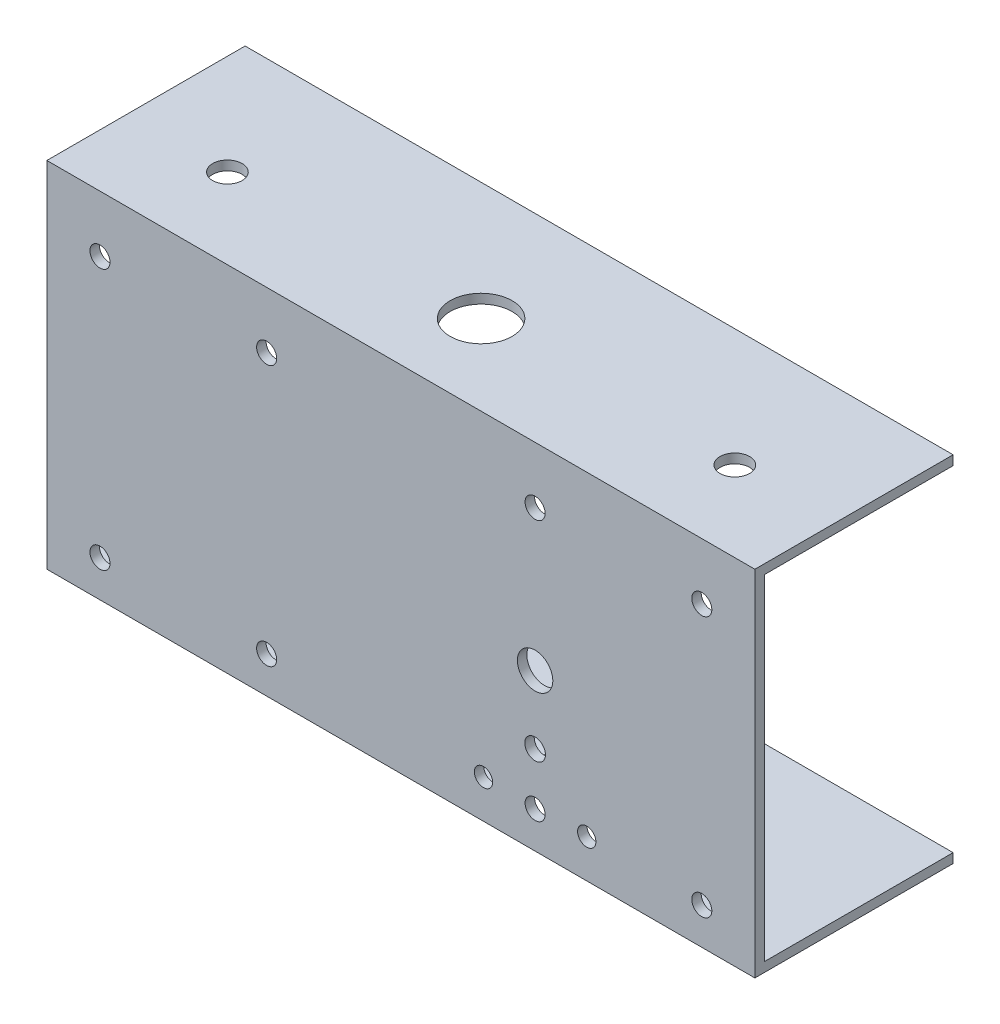
ISO-10303-21;
HEADER;
FILE_DESCRIPTION(('STEP AP214'),'2;1');
FILE_NAME('part.step','',(''),(''),'','','');
FILE_SCHEMA(('AUTOMOTIVE_DESIGN { 1 0 10303 214 1 1 1 1 }'));
ENDSEC;
DATA;
#1=APPLICATION_CONTEXT('core data for automotive mechanical design processes');
#2=APPLICATION_PROTOCOL_DEFINITION('international standard','automotive_design',2000,#1);
#3=PRODUCT_CONTEXT('',#1,'mechanical');
#4=PRODUCT('Part','Part','',(#3));
#5=PRODUCT_RELATED_PRODUCT_CATEGORY('part','',(#4));
#6=PRODUCT_DEFINITION_FORMATION('','',#4);
#7=PRODUCT_DEFINITION_CONTEXT('part definition',#1,'design');
#8=PRODUCT_DEFINITION('design','',#6,#7);
#9=PRODUCT_DEFINITION_SHAPE('','',#8);
#10=(LENGTH_UNIT() NAMED_UNIT(*) SI_UNIT(.MILLI.,.METRE.));
#11=(NAMED_UNIT(*) PLANE_ANGLE_UNIT() SI_UNIT($,.RADIAN.));
#12=(NAMED_UNIT(*) SI_UNIT($,.STERADIAN.) SOLID_ANGLE_UNIT());
#13=UNCERTAINTY_MEASURE_WITH_UNIT(LENGTH_MEASURE(1.E-05),#10,'distance_accuracy_value','');
#14=(GEOMETRIC_REPRESENTATION_CONTEXT(3) GLOBAL_UNCERTAINTY_ASSIGNED_CONTEXT((#13)) GLOBAL_UNIT_ASSIGNED_CONTEXT((#10,
#11,#12)) REPRESENTATION_CONTEXT('',''));
#15=CARTESIAN_POINT('',(0.,0.,0.));
#16=DIRECTION('',(0.,0.,1.));
#17=DIRECTION('',(1.,0.,0.));
#18=AXIS2_PLACEMENT_3D('',#15,#16,#17);
#19=CARTESIAN_POINT('',(60.,60.,12.));
#20=DIRECTION('',(0.,0.,-1.));
#21=DIRECTION('',(-1.,0.,0.));
#22=AXIS2_PLACEMENT_3D('',#19,#20,#21);
#23=PLANE('',#22);
#24=CARTESIAN_POINT('',(51.0000000000001,50.4,12.));
#25=DIRECTION('',(0.,0.,-1.));
#26=DIRECTION('',(-1.,0.,0.));
#27=AXIS2_PLACEMENT_3D('',#24,#25,#26);
#28=CIRCLE('',#27,1.70000000000001);
#29=CARTESIAN_POINT('',(49.3000000000001,50.4,12.));
#30=VERTEX_POINT('',#29);
#31=EDGE_CURVE('E664',#30,#30,#28,.F.);
#32=ORIENTED_EDGE('',*,*,#31,.T.);
#33=EDGE_LOOP('',(#32));
#34=FACE_BOUND('',#33,.T.);
#35=CARTESIAN_POINT('',(-22.7499999999999,6.2,12.));
#36=DIRECTION('',(0.,0.,1.));
#37=DIRECTION('',(1.,0.,0.));
#38=AXIS2_PLACEMENT_3D('',#35,#36,#37);
#39=CIRCLE('',#38,1.70000000000001);
#40=CARTESIAN_POINT('',(-21.0499999999999,6.2,12.));
#41=VERTEX_POINT('',#40);
#42=EDGE_CURVE('E665',#41,#41,#39,.T.);
#43=ORIENTED_EDGE('',*,*,#42,.T.);
#44=EDGE_LOOP('',(#43));
#45=FACE_BOUND('',#44,.T.);
#46=CARTESIAN_POINT('',(22.75,6.19999999999998,12.));
#47=DIRECTION('',(0.,0.,-1.));
#48=DIRECTION('',(-1.,0.,0.));
#49=AXIS2_PLACEMENT_3D('',#46,#47,#48);
#50=CIRCLE('',#49,1.70000000000001);
#51=CARTESIAN_POINT('',(21.05,6.19999999999998,12.));
#52=VERTEX_POINT('',#51);
#53=EDGE_CURVE('E670',#52,#52,#50,.T.);
#54=ORIENTED_EDGE('',*,*,#53,.F.);
#55=EDGE_LOOP('',(#54));
#56=FACE_BOUND('',#55,.T.);
#57=CARTESIAN_POINT('',(51.0000000000001,6.19999999999998,12.));
#58=DIRECTION('',(0.,0.,-1.));
#59=DIRECTION('',(-1.,0.,0.));
#60=AXIS2_PLACEMENT_3D('',#57,#58,#59);
#61=CIRCLE('',#60,1.70000000000001);
#62=CARTESIAN_POINT('',(49.3000000000001,6.19999999999998,12.));
#63=VERTEX_POINT('',#62);
#64=EDGE_CURVE('E701',#63,#63,#61,.T.);
#65=ORIENTED_EDGE('',*,*,#64,.F.);
#66=EDGE_LOOP('',(#65));
#67=FACE_BOUND('',#66,.T.);
#68=CARTESIAN_POINT('',(-51.,50.4,12.));
#69=DIRECTION('',(0.,0.,-1.));
#70=DIRECTION('',(-1.,0.,0.));
#71=AXIS2_PLACEMENT_3D('',#68,#69,#70);
#72=CIRCLE('',#71,1.70000000000001);
#73=CARTESIAN_POINT('',(-52.7,50.4,12.));
#74=VERTEX_POINT('',#73);
#75=EDGE_CURVE('E255',#74,#74,#72,.T.);
#76=ORIENTED_EDGE('',*,*,#75,.F.);
#77=EDGE_LOOP('',(#76));
#78=FACE_BOUND('',#77,.T.);
#79=CARTESIAN_POINT('',(22.75,26.5,12.));
#80=DIRECTION('',(0.,0.,-1.));
#81=DIRECTION('',(-1.,0.,0.));
#82=AXIS2_PLACEMENT_3D('',#79,#80,#81);
#83=CIRCLE('',#82,3.);
#84=CARTESIAN_POINT('',(19.75,26.5,12.));
#85=VERTEX_POINT('',#84);
#86=EDGE_CURVE('E241',#85,#85,#83,.F.);
#87=ORIENTED_EDGE('',*,*,#86,.T.);
#88=EDGE_LOOP('',(#87));
#89=FACE_BOUND('',#88,.T.);
#90=CARTESIAN_POINT('',(22.75,15.,12.));
#91=DIRECTION('',(0.,0.,-1.));
#92=DIRECTION('',(-1.,0.,0.));
#93=AXIS2_PLACEMENT_3D('',#90,#91,#92);
#94=CIRCLE('',#93,1.75);
#95=CARTESIAN_POINT('',(21.,15.,12.));
#96=VERTEX_POINT('',#95);
#97=EDGE_CURVE('E283',#96,#96,#94,.F.);
#98=ORIENTED_EDGE('',*,*,#97,.T.);
#99=EDGE_LOOP('',(#98));
#100=FACE_BOUND('',#99,.T.);
#101=CARTESIAN_POINT('',(14.,6.5,12.));
#102=DIRECTION('',(0.,0.,-1.));
#103=DIRECTION('',(-1.,0.,0.));
#104=AXIS2_PLACEMENT_3D('',#101,#102,#103);
#105=CIRCLE('',#104,1.55);
#106=CARTESIAN_POINT('',(12.45,6.5,12.));
#107=VERTEX_POINT('',#106);
#108=EDGE_CURVE('E274',#107,#107,#105,.F.);
#109=ORIENTED_EDGE('',*,*,#108,.T.);
#110=EDGE_LOOP('',(#109));
#111=FACE_BOUND('',#110,.T.);
#112=CARTESIAN_POINT('',(31.5,6.50000000000001,12.));
#113=DIRECTION('',(0.,0.,-1.));
#114=DIRECTION('',(-1.,0.,0.));
#115=AXIS2_PLACEMENT_3D('',#112,#113,#114);
#116=CIRCLE('',#115,1.55);
#117=CARTESIAN_POINT('',(29.95,6.50000000000001,12.));
#118=VERTEX_POINT('',#117);
#119=EDGE_CURVE('E278',#118,#118,#116,.T.);
#120=ORIENTED_EDGE('',*,*,#119,.F.);
#121=EDGE_LOOP('',(#120));
#122=FACE_BOUND('',#121,.T.);
#123=CARTESIAN_POINT('',(-22.7499999999999,50.4,12.));
#124=DIRECTION('',(0.,0.,-1.));
#125=DIRECTION('',(-1.,0.,0.));
#126=AXIS2_PLACEMENT_3D('',#123,#124,#125);
#127=CIRCLE('',#126,1.70000000000001);
#128=CARTESIAN_POINT('',(-24.4499999999999,50.4,12.));
#129=VERTEX_POINT('',#128);
#130=EDGE_CURVE('E674',#129,#129,#127,.T.);
#131=ORIENTED_EDGE('',*,*,#130,.F.);
#132=EDGE_LOOP('',(#131));
#133=FACE_BOUND('',#132,.T.);
#134=CARTESIAN_POINT('',(22.75,50.4,12.));
#135=DIRECTION('',(0.,0.,-1.));
#136=DIRECTION('',(-1.,0.,0.));
#137=AXIS2_PLACEMENT_3D('',#134,#135,#136);
#138=CIRCLE('',#137,1.70000000000001);
#139=CARTESIAN_POINT('',(21.05,50.4,12.));
#140=VERTEX_POINT('',#139);
#141=EDGE_CURVE('E667',#140,#140,#138,.F.);
#142=ORIENTED_EDGE('',*,*,#141,.T.);
#143=EDGE_LOOP('',(#142));
#144=FACE_BOUND('',#143,.T.);
#145=CARTESIAN_POINT('',(-51.,6.2,12.));
#146=DIRECTION('',(0.,0.,1.));
#147=DIRECTION('',(1.,0.,0.));
#148=AXIS2_PLACEMENT_3D('',#145,#146,#147);
#149=CIRCLE('',#148,1.70000000000001);
#150=CARTESIAN_POINT('',(-49.3,6.2,12.));
#151=VERTEX_POINT('',#150);
#152=EDGE_CURVE('E662',#151,#151,#149,.T.);
#153=ORIENTED_EDGE('',*,*,#152,.T.);
#154=EDGE_LOOP('',(#153));
#155=FACE_BOUND('',#154,.T.);
#156=DIRECTION('',(0.,-1.,0.));
#157=VECTOR('',#156,1.);
#158=CARTESIAN_POINT('',(-60.,60.,12.));
#159=LINE('',#158,#157);
#160=CARTESIAN_POINT('',(-60.,58.4,12.));
#161=VERTEX_POINT('',#160);
#162=CARTESIAN_POINT('',(-60.,1.6,12.));
#163=VERTEX_POINT('',#162);
#164=EDGE_CURVE('E166',#161,#163,#159,.T.);
#165=ORIENTED_EDGE('',*,*,#164,.F.);
#166=DIRECTION('',(1.,0.,0.));
#167=VECTOR('',#166,1.);
#168=CARTESIAN_POINT('',(60.,58.4,12.));
#169=LINE('',#168,#167);
#170=CARTESIAN_POINT('',(60.,58.4,12.));
#171=VERTEX_POINT('',#170);
#172=EDGE_CURVE('E49',#161,#171,#169,.T.);
#173=ORIENTED_EDGE('',*,*,#172,.T.);
#174=DIRECTION('',(0.,-1.,0.));
#175=VECTOR('',#174,1.);
#176=CARTESIAN_POINT('',(60.,60.,12.));
#177=LINE('',#176,#175);
#178=CARTESIAN_POINT('',(60.,1.6,12.));
#179=VERTEX_POINT('',#178);
#180=EDGE_CURVE('E163',#171,#179,#177,.T.);
#181=ORIENTED_EDGE('',*,*,#180,.T.);
#182=DIRECTION('',(1.,0.,0.));
#183=VECTOR('',#182,1.);
#184=CARTESIAN_POINT('',(60.,1.6,12.));
#185=LINE('',#184,#183);
#186=CARTESIAN_POINT('',(34.5,1.6,12.));
#187=VERTEX_POINT('',#186);
#188=EDGE_CURVE('E209',#187,#179,#185,.T.);
#189=ORIENTED_EDGE('',*,*,#188,.F.);
#190=DIRECTION('',(0.,-1.,0.));
#191=VECTOR('',#190,1.);
#192=CARTESIAN_POINT('',(34.5,1.6,12.));
#193=LINE('',#192,#191);
#194=CARTESIAN_POINT('',(34.5,0.,12.));
#195=VERTEX_POINT('',#194);
#196=EDGE_CURVE('E212',#187,#195,#193,.T.);
#197=ORIENTED_EDGE('',*,*,#196,.T.);
#198=DIRECTION('',(1.,0.,0.));
#199=VECTOR('',#198,1.);
#200=CARTESIAN_POINT('',(60.,0.,12.));
#201=LINE('',#200,#199);
#202=CARTESIAN_POINT('',(11.,0.,12.));
#203=VERTEX_POINT('',#202);
#204=EDGE_CURVE('E154',#203,#195,#201,.T.);
#205=ORIENTED_EDGE('',*,*,#204,.F.);
#206=DIRECTION('',(0.,-1.,0.));
#207=VECTOR('',#206,1.);
#208=CARTESIAN_POINT('',(11.,1.6,12.));
#209=LINE('',#208,#207);
#210=CARTESIAN_POINT('',(11.,1.6,12.));
#211=VERTEX_POINT('',#210);
#212=EDGE_CURVE('E232',#211,#203,#209,.T.);
#213=ORIENTED_EDGE('',*,*,#212,.F.);
#214=DIRECTION('',(1.,0.,0.));
#215=VECTOR('',#214,1.);
#216=CARTESIAN_POINT('',(11.,1.6,12.));
#217=LINE('',#216,#215);
#218=EDGE_CURVE('E200',#163,#211,#217,.T.);
#219=ORIENTED_EDGE('',*,*,#218,.F.);
#220=EDGE_LOOP('',(#165,#173,#181,#189,#197,#205,#213,#219));
#221=FACE_BOUND('',#220,.T.);
#222=ADVANCED_FACE('F32',(#34,#45,#56,#67,#78,#89,#100,#111,#122,#133,#144,#155,#221),#23,.T.);
#223=CARTESIAN_POINT('',(60.,60.,13.6));
#224=DIRECTION('',(0.,0.,1.));
#225=DIRECTION('',(1.,0.,0.));
#226=AXIS2_PLACEMENT_3D('',#223,#224,#225);
#227=PLANE('',#226);
#228=CARTESIAN_POINT('',(51.0000000000001,50.4,13.6));
#229=DIRECTION('',(0.,0.,1.));
#230=DIRECTION('',(1.,0.,0.));
#231=AXIS2_PLACEMENT_3D('',#228,#229,#230);
#232=CIRCLE('',#231,1.70000000000001);
#233=CARTESIAN_POINT('',(52.7000000000001,50.4,13.6));
#234=VERTEX_POINT('',#233);
#235=EDGE_CURVE('E269',#234,#234,#232,.F.);
#236=ORIENTED_EDGE('',*,*,#235,.T.);
#237=EDGE_LOOP('',(#236));
#238=FACE_BOUND('',#237,.T.);
#239=CARTESIAN_POINT('',(-22.7499999999999,6.2,13.6));
#240=DIRECTION('',(0.,0.,1.));
#241=DIRECTION('',(1.,0.,0.));
#242=AXIS2_PLACEMENT_3D('',#239,#240,#241);
#243=CIRCLE('',#242,1.70000000000001);
#244=CARTESIAN_POINT('',(-21.0499999999999,6.2,13.6));
#245=VERTEX_POINT('',#244);
#246=EDGE_CURVE('E261',#245,#245,#243,.F.);
#247=ORIENTED_EDGE('',*,*,#246,.T.);
#248=EDGE_LOOP('',(#247));
#249=FACE_BOUND('',#248,.T.);
#250=CARTESIAN_POINT('',(22.75,6.19999999999998,13.6));
#251=DIRECTION('',(0.,0.,1.));
#252=DIRECTION('',(1.,0.,0.));
#253=AXIS2_PLACEMENT_3D('',#250,#251,#252);
#254=CIRCLE('',#253,1.70000000000001);
#255=CARTESIAN_POINT('',(24.45,6.19999999999998,13.6));
#256=VERTEX_POINT('',#255);
#257=EDGE_CURVE('E258',#256,#256,#254,.T.);
#258=ORIENTED_EDGE('',*,*,#257,.F.);
#259=EDGE_LOOP('',(#258));
#260=FACE_BOUND('',#259,.T.);
#261=CARTESIAN_POINT('',(51.0000000000001,6.19999999999998,13.6));
#262=DIRECTION('',(0.,0.,1.));
#263=DIRECTION('',(1.,0.,0.));
#264=AXIS2_PLACEMENT_3D('',#261,#262,#263);
#265=CIRCLE('',#264,1.70000000000001);
#266=CARTESIAN_POINT('',(52.7000000000001,6.19999999999998,13.6));
#267=VERTEX_POINT('',#266);
#268=EDGE_CURVE('E254',#267,#267,#265,.T.);
#269=ORIENTED_EDGE('',*,*,#268,.F.);
#270=EDGE_LOOP('',(#269));
#271=FACE_BOUND('',#270,.T.);
#272=CARTESIAN_POINT('',(-51.,50.4,13.6));
#273=DIRECTION('',(0.,0.,1.));
#274=DIRECTION('',(1.,0.,0.));
#275=AXIS2_PLACEMENT_3D('',#272,#273,#274);
#276=CIRCLE('',#275,1.70000000000001);
#277=CARTESIAN_POINT('',(-49.3,50.4,13.6));
#278=VERTEX_POINT('',#277);
#279=EDGE_CURVE('E251',#278,#278,#276,.T.);
#280=ORIENTED_EDGE('',*,*,#279,.F.);
#281=EDGE_LOOP('',(#280));
#282=FACE_BOUND('',#281,.T.);
#283=CARTESIAN_POINT('',(22.75,26.5,13.6));
#284=DIRECTION('',(0.,0.,1.));
#285=DIRECTION('',(1.,0.,0.));
#286=AXIS2_PLACEMENT_3D('',#283,#284,#285);
#287=CIRCLE('',#286,3.);
#288=CARTESIAN_POINT('',(25.75,26.5,13.6));
#289=VERTEX_POINT('',#288);
#290=EDGE_CURVE('E247',#289,#289,#287,.F.);
#291=ORIENTED_EDGE('',*,*,#290,.T.);
#292=EDGE_LOOP('',(#291));
#293=FACE_BOUND('',#292,.T.);
#294=CARTESIAN_POINT('',(22.75,15.,13.6));
#295=DIRECTION('',(0.,0.,1.));
#296=DIRECTION('',(1.,0.,0.));
#297=AXIS2_PLACEMENT_3D('',#294,#295,#296);
#298=CIRCLE('',#297,1.75);
#299=CARTESIAN_POINT('',(24.5,15.,13.6));
#300=VERTEX_POINT('',#299);
#301=EDGE_CURVE('E244',#300,#300,#298,.F.);
#302=ORIENTED_EDGE('',*,*,#301,.T.);
#303=EDGE_LOOP('',(#302));
#304=FACE_BOUND('',#303,.T.);
#305=CARTESIAN_POINT('',(14.,6.5,13.6));
#306=DIRECTION('',(0.,0.,1.));
#307=DIRECTION('',(1.,0.,0.));
#308=AXIS2_PLACEMENT_3D('',#305,#306,#307);
#309=CIRCLE('',#308,1.55);
#310=CARTESIAN_POINT('',(15.55,6.5,13.6));
#311=VERTEX_POINT('',#310);
#312=EDGE_CURVE('E237',#311,#311,#309,.F.);
#313=ORIENTED_EDGE('',*,*,#312,.T.);
#314=EDGE_LOOP('',(#313));
#315=FACE_BOUND('',#314,.T.);
#316=DIRECTION('',(-1.,0.,0.));
#317=VECTOR('',#316,1.);
#318=CARTESIAN_POINT('',(60.,0.,13.6));
#319=LINE('',#318,#317);
#320=CARTESIAN_POINT('',(60.,0.,13.6));
#321=VERTEX_POINT('',#320);
#322=CARTESIAN_POINT('',(-60.,0.,13.6));
#323=VERTEX_POINT('',#322);
#324=EDGE_CURVE('E131',#321,#323,#319,.T.);
#325=ORIENTED_EDGE('',*,*,#324,.F.);
#326=DIRECTION('',(0.,-1.,0.));
#327=VECTOR('',#326,1.);
#328=CARTESIAN_POINT('',(60.,60.,13.6));
#329=LINE('',#328,#327);
#330=CARTESIAN_POINT('',(60.,60.,13.6));
#331=VERTEX_POINT('',#330);
#332=EDGE_CURVE('E158',#331,#321,#329,.T.);
#333=ORIENTED_EDGE('',*,*,#332,.F.);
#334=DIRECTION('',(-1.,0.,0.));
#335=VECTOR('',#334,1.);
#336=CARTESIAN_POINT('',(60.,60.,13.6));
#337=LINE('',#336,#335);
#338=CARTESIAN_POINT('',(-60.,60.,13.6));
#339=VERTEX_POINT('',#338);
#340=EDGE_CURVE('E153',#331,#339,#337,.T.);
#341=ORIENTED_EDGE('',*,*,#340,.T.);
#342=DIRECTION('',(0.,-1.,0.));
#343=VECTOR('',#342,1.);
#344=CARTESIAN_POINT('',(-60.,60.,13.6));
#345=LINE('',#344,#343);
#346=EDGE_CURVE('E168',#339,#323,#345,.T.);
#347=ORIENTED_EDGE('',*,*,#346,.T.);
#348=EDGE_LOOP('',(#325,#333,#341,#347));
#349=FACE_BOUND('',#348,.T.);
#350=CARTESIAN_POINT('',(31.5,6.50000000000001,13.6));
#351=DIRECTION('',(0.,0.,1.));
#352=DIRECTION('',(1.,0.,0.));
#353=AXIS2_PLACEMENT_3D('',#350,#351,#352);
#354=CIRCLE('',#353,1.55);
#355=CARTESIAN_POINT('',(33.05,6.50000000000001,13.6));
#356=VERTEX_POINT('',#355);
#357=EDGE_CURVE('E240',#356,#356,#354,.T.);
#358=ORIENTED_EDGE('',*,*,#357,.F.);
#359=EDGE_LOOP('',(#358));
#360=FACE_BOUND('',#359,.T.);
#361=CARTESIAN_POINT('',(-22.7499999999999,50.4,13.6));
#362=DIRECTION('',(0.,0.,1.));
#363=DIRECTION('',(1.,0.,0.));
#364=AXIS2_PLACEMENT_3D('',#361,#362,#363);
#365=CIRCLE('',#364,1.70000000000001);
#366=CARTESIAN_POINT('',(-21.0499999999999,50.4,13.6));
#367=VERTEX_POINT('',#366);
#368=EDGE_CURVE('E264',#367,#367,#365,.T.);
#369=ORIENTED_EDGE('',*,*,#368,.F.);
#370=EDGE_LOOP('',(#369));
#371=FACE_BOUND('',#370,.T.);
#372=CARTESIAN_POINT('',(22.75,50.4,13.6));
#373=DIRECTION('',(0.,0.,1.));
#374=DIRECTION('',(1.,0.,0.));
#375=AXIS2_PLACEMENT_3D('',#372,#373,#374);
#376=CIRCLE('',#375,1.70000000000001);
#377=CARTESIAN_POINT('',(24.45,50.4,13.6));
#378=VERTEX_POINT('',#377);
#379=EDGE_CURVE('E267',#378,#378,#376,.F.);
#380=ORIENTED_EDGE('',*,*,#379,.T.);
#381=EDGE_LOOP('',(#380));
#382=FACE_BOUND('',#381,.T.);
#383=CARTESIAN_POINT('',(-51.,6.2,13.6));
#384=DIRECTION('',(0.,0.,1.));
#385=DIRECTION('',(1.,0.,0.));
#386=AXIS2_PLACEMENT_3D('',#383,#384,#385);
#387=CIRCLE('',#386,1.70000000000001);
#388=CARTESIAN_POINT('',(-49.3,6.2,13.6));
#389=VERTEX_POINT('',#388);
#390=EDGE_CURVE('E36',#389,#389,#387,.F.);
#391=ORIENTED_EDGE('',*,*,#390,.T.);
#392=EDGE_LOOP('',(#391));
#393=FACE_BOUND('',#392,.T.);
#394=ADVANCED_FACE('F338',(#238,#249,#260,#271,#282,#293,#304,#315,#349,#360,#371,#382,#393),
#227,.T.);
#395=CARTESIAN_POINT('',(0.,1.6,0.));
#396=DIRECTION('',(0.,-1.,0.));
#397=DIRECTION('',(0.,0.,-1.));
#398=AXIS2_PLACEMENT_3D('',#395,#396,#397);
#399=PLANE('',#398);
#400=DIRECTION('',(0.,0.,-1.));
#401=VECTOR('',#400,1.);
#402=CARTESIAN_POINT('',(60.,1.6,12.));
#403=LINE('',#402,#401);
#404=CARTESIAN_POINT('',(60.,1.6,-20.));
#405=VERTEX_POINT('',#404);
#406=EDGE_CURVE('E191',#179,#405,#403,.T.);
#407=ORIENTED_EDGE('',*,*,#406,.T.);
#408=DIRECTION('',(-1.,0.,0.));
#409=VECTOR('',#408,1.);
#410=CARTESIAN_POINT('',(-60.,1.6,-20.));
#411=LINE('',#410,#409);
#412=CARTESIAN_POINT('',(-60.,1.6,-20.));
#413=VERTEX_POINT('',#412);
#414=EDGE_CURVE('E194',#405,#413,#411,.T.);
#415=ORIENTED_EDGE('',*,*,#414,.T.);
#416=DIRECTION('',(0.,0.,1.));
#417=VECTOR('',#416,1.);
#418=CARTESIAN_POINT('',(-60.,1.6,12.));
#419=LINE('',#418,#417);
#420=EDGE_CURVE('E197',#413,#163,#419,.T.);
#421=ORIENTED_EDGE('',*,*,#420,.T.);
#422=ORIENTED_EDGE('',*,*,#218,.T.);
#423=DIRECTION('',(0.,0.,-1.));
#424=VECTOR('',#423,1.);
#425=CARTESIAN_POINT('',(11.,1.6,-13.5));
#426=LINE('',#425,#424);
#427=CARTESIAN_POINT('',(11.,1.6,-13.5));
#428=VERTEX_POINT('',#427);
#429=EDGE_CURVE('E203',#211,#428,#426,.T.);
#430=ORIENTED_EDGE('',*,*,#429,.T.);
#431=DIRECTION('',(1.,0.,0.));
#432=VECTOR('',#431,1.);
#433=CARTESIAN_POINT('',(34.5,1.6,-13.5));
#434=LINE('',#433,#432);
#435=CARTESIAN_POINT('',(34.5,1.6,-13.5));
#436=VERTEX_POINT('',#435);
#437=EDGE_CURVE('E205',#428,#436,#434,.T.);
#438=ORIENTED_EDGE('',*,*,#437,.T.);
#439=DIRECTION('',(0.,0.,1.));
#440=VECTOR('',#439,1.);
#441=CARTESIAN_POINT('',(34.5,1.6,12.));
#442=LINE('',#441,#440);
#443=EDGE_CURVE('E207',#436,#187,#442,.T.);
#444=ORIENTED_EDGE('',*,*,#443,.T.);
#445=ORIENTED_EDGE('',*,*,#188,.T.);
#446=EDGE_LOOP('',(#407,#415,#421,#422,#430,#438,#444,#445));
#447=FACE_BOUND('',#446,.T.);
#448=CARTESIAN_POINT('',(0.,1.6,0.));
#449=DIRECTION('',(0.,1.,0.));
#450=DIRECTION('',(0.,0.,1.));
#451=AXIS2_PLACEMENT_3D('',#448,#449,#450);
#452=CIRCLE('',#451,5.25);
#453=CARTESIAN_POINT('',(0.,1.6,5.25));
#454=VERTEX_POINT('',#453);
#455=EDGE_CURVE('E185',#454,#454,#452,.T.);
#456=ORIENTED_EDGE('',*,*,#455,.F.);
#457=EDGE_LOOP('',(#456));
#458=FACE_BOUND('',#457,.T.);
#459=CARTESIAN_POINT('',(-43.,1.6,0.));
#460=DIRECTION('',(0.,1.,0.));
#461=DIRECTION('',(0.,0.,1.));
#462=AXIS2_PLACEMENT_3D('',#459,#460,#461);
#463=CIRCLE('',#462,2.5);
#464=CARTESIAN_POINT('',(-43.,1.6,2.5));
#465=VERTEX_POINT('',#464);
#466=EDGE_CURVE('E179',#465,#465,#463,.T.);
#467=ORIENTED_EDGE('',*,*,#466,.F.);
#468=EDGE_LOOP('',(#467));
#469=FACE_BOUND('',#468,.T.);
#470=CARTESIAN_POINT('',(43.,1.6,0.));
#471=DIRECTION('',(0.,1.,0.));
#472=DIRECTION('',(0.,0.,-1.));
#473=AXIS2_PLACEMENT_3D('',#470,#471,#472);
#474=CIRCLE('',#473,2.5);
#475=CARTESIAN_POINT('',(43.,1.6,-2.5));
#476=VERTEX_POINT('',#475);
#477=EDGE_CURVE('E173',#476,#476,#474,.T.);
#478=ORIENTED_EDGE('',*,*,#477,.F.);
#479=EDGE_LOOP('',(#478));
#480=FACE_BOUND('',#479,.T.);
#481=ADVANCED_FACE('F308',(#447,#458,#469,#480),#399,.F.);
#482=CARTESIAN_POINT('',(0.,0.,0.));
#483=DIRECTION('',(0.,-1.,0.));
#484=DIRECTION('',(0.,0.,-1.));
#485=AXIS2_PLACEMENT_3D('',#482,#483,#484);
#486=PLANE('',#485);
#487=DIRECTION('',(0.,0.,-1.));
#488=VECTOR('',#487,1.);
#489=CARTESIAN_POINT('',(11.,0.,-13.5));
#490=LINE('',#489,#488);
#491=CARTESIAN_POINT('',(11.,0.,-13.5));
#492=VERTEX_POINT('',#491);
#493=EDGE_CURVE('E219',#203,#492,#490,.T.);
#494=ORIENTED_EDGE('',*,*,#493,.F.);
#495=ORIENTED_EDGE('',*,*,#204,.T.);
#496=DIRECTION('',(0.,0.,1.));
#497=VECTOR('',#496,1.);
#498=CARTESIAN_POINT('',(34.5,0.,12.));
#499=LINE('',#498,#497);
#500=CARTESIAN_POINT('',(34.5,0.,-13.5));
#501=VERTEX_POINT('',#500);
#502=EDGE_CURVE('E195',#501,#195,#499,.T.);
#503=ORIENTED_EDGE('',*,*,#502,.F.);
#504=DIRECTION('',(1.,0.,0.));
#505=VECTOR('',#504,1.);
#506=CARTESIAN_POINT('',(34.5,0.,-13.5));
#507=LINE('',#506,#505);
#508=EDGE_CURVE('E221',#492,#501,#507,.T.);
#509=ORIENTED_EDGE('',*,*,#508,.F.);
#510=EDGE_LOOP('',(#494,#495,#503,#509));
#511=FACE_BOUND('',#510,.T.);
#512=CARTESIAN_POINT('',(-43.,0.,0.));
#513=DIRECTION('',(0.,1.,0.));
#514=DIRECTION('',(0.,0.,1.));
#515=AXIS2_PLACEMENT_3D('',#512,#513,#514);
#516=CIRCLE('',#515,2.5);
#517=CARTESIAN_POINT('',(-43.,0.,2.5));
#518=VERTEX_POINT('',#517);
#519=EDGE_CURVE('E176',#518,#518,#516,.T.);
#520=ORIENTED_EDGE('',*,*,#519,.T.);
#521=EDGE_LOOP('',(#520));
#522=FACE_BOUND('',#521,.T.);
#523=DIRECTION('',(0.,0.,-1.));
#524=VECTOR('',#523,1.);
#525=CARTESIAN_POINT('',(60.,0.,12.));
#526=LINE('',#525,#524);
#527=CARTESIAN_POINT('',(60.,0.,-20.));
#528=VERTEX_POINT('',#527);
#529=EDGE_CURVE('E188',#321,#528,#526,.T.);
#530=ORIENTED_EDGE('',*,*,#529,.F.);
#531=ORIENTED_EDGE('',*,*,#324,.T.);
#532=DIRECTION('',(0.,0.,1.));
#533=VECTOR('',#532,1.);
#534=CARTESIAN_POINT('',(-60.,0.,12.));
#535=LINE('',#534,#533);
#536=CARTESIAN_POINT('',(-60.,0.,-20.));
#537=VERTEX_POINT('',#536);
#538=EDGE_CURVE('E217',#537,#323,#535,.T.);
#539=ORIENTED_EDGE('',*,*,#538,.F.);
#540=DIRECTION('',(-1.,0.,0.));
#541=VECTOR('',#540,1.);
#542=CARTESIAN_POINT('',(-60.,0.,-20.));
#543=LINE('',#542,#541);
#544=EDGE_CURVE('E215',#528,#537,#543,.T.);
#545=ORIENTED_EDGE('',*,*,#544,.F.);
#546=EDGE_LOOP('',(#530,#531,#539,#545));
#547=FACE_BOUND('',#546,.T.);
#548=CARTESIAN_POINT('',(0.,0.,0.));
#549=DIRECTION('',(0.,1.,0.));
#550=DIRECTION('',(0.,0.,1.));
#551=AXIS2_PLACEMENT_3D('',#548,#549,#550);
#552=CIRCLE('',#551,5.25);
#553=CARTESIAN_POINT('',(0.,0.,5.25));
#554=VERTEX_POINT('',#553);
#555=EDGE_CURVE('E182',#554,#554,#552,.T.);
#556=ORIENTED_EDGE('',*,*,#555,.T.);
#557=EDGE_LOOP('',(#556));
#558=FACE_BOUND('',#557,.T.);
#559=CARTESIAN_POINT('',(43.,0.,0.));
#560=DIRECTION('',(0.,1.,0.));
#561=DIRECTION('',(0.,0.,-1.));
#562=AXIS2_PLACEMENT_3D('',#559,#560,#561);
#563=CIRCLE('',#562,2.5);
#564=CARTESIAN_POINT('',(43.,0.,-2.5));
#565=VERTEX_POINT('',#564);
#566=EDGE_CURVE('E165',#565,#565,#563,.T.);
#567=ORIENTED_EDGE('',*,*,#566,.T.);
#568=EDGE_LOOP('',(#567));
#569=FACE_BOUND('',#568,.T.);
#570=ADVANCED_FACE('F319',(#511,#522,#547,#558,#569),#486,.T.);
#571=CARTESIAN_POINT('',(60.,1.6,12.));
#572=DIRECTION('',(-1.,0.,0.));
#573=DIRECTION('',(0.,0.,1.));
#574=AXIS2_PLACEMENT_3D('',#571,#572,#573);
#575=PLANE('',#574);
#576=ORIENTED_EDGE('',*,*,#529,.T.);
#577=DIRECTION('',(0.,-1.,0.));
#578=VECTOR('',#577,1.);
#579=CARTESIAN_POINT('',(60.,1.6,-20.));
#580=LINE('',#579,#578);
#581=EDGE_CURVE('E11',#405,#528,#580,.T.);
#582=ORIENTED_EDGE('',*,*,#581,.F.);
#583=ORIENTED_EDGE('',*,*,#406,.F.);
#584=ORIENTED_EDGE('',*,*,#180,.F.);
#585=DIRECTION('',(0.,0.,-1.));
#586=VECTOR('',#585,1.);
#587=CARTESIAN_POINT('',(60.,58.4,12.));
#588=LINE('',#587,#586);
#589=CARTESIAN_POINT('',(60.,58.4,-20.));
#590=VERTEX_POINT('',#589);
#591=EDGE_CURVE('E147',#171,#590,#588,.T.);
#592=ORIENTED_EDGE('',*,*,#591,.T.);
#593=DIRECTION('',(0.,1.,0.));
#594=VECTOR('',#593,1.);
#595=CARTESIAN_POINT('',(60.,58.4,-20.));
#596=LINE('',#595,#594);
#597=CARTESIAN_POINT('',(60.,60.,-20.));
#598=VERTEX_POINT('',#597);
#599=EDGE_CURVE('E132',#590,#598,#596,.T.);
#600=ORIENTED_EDGE('',*,*,#599,.T.);
#601=DIRECTION('',(0.,0.,1.));
#602=VECTOR('',#601,1.);
#603=CARTESIAN_POINT('',(60.,60.,12.));
#604=LINE('',#603,#602);
#605=EDGE_CURVE('E150',#598,#331,#604,.T.);
#606=ORIENTED_EDGE('',*,*,#605,.T.);
#607=ORIENTED_EDGE('',*,*,#332,.T.);
#608=EDGE_LOOP('',(#576,#582,#583,#584,#592,#600,#606,#607));
#609=FACE_BOUND('',#608,.T.);
#610=ADVANCED_FACE('F34',(#609),#575,.F.);
#611=CARTESIAN_POINT('',(-60.,1.6,-20.));
#612=DIRECTION('',(0.,0.,1.));
#613=DIRECTION('',(1.,0.,0.));
#614=AXIS2_PLACEMENT_3D('',#611,#612,#613);
#615=PLANE('',#614);
#616=ORIENTED_EDGE('',*,*,#544,.T.);
#617=DIRECTION('',(0.,-1.,0.));
#618=VECTOR('',#617,1.);
#619=CARTESIAN_POINT('',(-60.,1.6,-20.));
#620=LINE('',#619,#618);
#621=EDGE_CURVE('E41',#413,#537,#620,.T.);
#622=ORIENTED_EDGE('',*,*,#621,.F.);
#623=ORIENTED_EDGE('',*,*,#414,.F.);
#624=ORIENTED_EDGE('',*,*,#581,.T.);
#625=EDGE_LOOP('',(#616,#622,#623,#624));
#626=FACE_BOUND('',#625,.T.);
#627=ADVANCED_FACE('F368',(#626),#615,.F.);
#628=CARTESIAN_POINT('',(-60.,1.6,12.));
#629=DIRECTION('',(1.,0.,0.));
#630=DIRECTION('',(0.,0.,-1.));
#631=AXIS2_PLACEMENT_3D('',#628,#629,#630);
#632=PLANE('',#631);
#633=ORIENTED_EDGE('',*,*,#538,.T.);
#634=ORIENTED_EDGE('',*,*,#346,.F.);
#635=DIRECTION('',(0.,0.,-1.));
#636=VECTOR('',#635,1.);
#637=CARTESIAN_POINT('',(-60.,60.,12.));
#638=LINE('',#637,#636);
#639=CARTESIAN_POINT('',(-60.,60.,-20.));
#640=VERTEX_POINT('',#639);
#641=EDGE_CURVE('E126',#339,#640,#638,.T.);
#642=ORIENTED_EDGE('',*,*,#641,.T.);
#643=DIRECTION('',(0.,1.,0.));
#644=VECTOR('',#643,1.);
#645=CARTESIAN_POINT('',(-60.,58.4,-20.));
#646=LINE('',#645,#644);
#647=CARTESIAN_POINT('',(-60.,58.4,-20.));
#648=VERTEX_POINT('',#647);
#649=EDGE_CURVE('E122',#648,#640,#646,.T.);
#650=ORIENTED_EDGE('',*,*,#649,.F.);
#651=DIRECTION('',(0.,0.,1.));
#652=VECTOR('',#651,1.);
#653=CARTESIAN_POINT('',(-60.,58.4,12.));
#654=LINE('',#653,#652);
#655=EDGE_CURVE('E124',#648,#161,#654,.T.);
#656=ORIENTED_EDGE('',*,*,#655,.T.);
#657=ORIENTED_EDGE('',*,*,#164,.T.);
#658=ORIENTED_EDGE('',*,*,#420,.F.);
#659=ORIENTED_EDGE('',*,*,#621,.T.);
#660=EDGE_LOOP('',(#633,#634,#642,#650,#656,#657,#658,#659));
#661=FACE_BOUND('',#660,.T.);
#662=ADVANCED_FACE('F123',(#661),#632,.F.);
#663=CARTESIAN_POINT('',(11.,1.6,-13.5));
#664=DIRECTION('',(-1.,0.,0.));
#665=DIRECTION('',(0.,0.,1.));
#666=AXIS2_PLACEMENT_3D('',#663,#664,#665);
#667=PLANE('',#666);
#668=ORIENTED_EDGE('',*,*,#493,.T.);
#669=DIRECTION('',(0.,-1.,0.));
#670=VECTOR('',#669,1.);
#671=CARTESIAN_POINT('',(11.,1.6,-13.5));
#672=LINE('',#671,#670);
#673=EDGE_CURVE('E229',#428,#492,#672,.T.);
#674=ORIENTED_EDGE('',*,*,#673,.F.);
#675=ORIENTED_EDGE('',*,*,#429,.F.);
#676=ORIENTED_EDGE('',*,*,#212,.T.);
#677=EDGE_LOOP('',(#668,#674,#675,#676));
#678=FACE_BOUND('',#677,.T.);
#679=ADVANCED_FACE('F324',(#678),#667,.F.);
#680=CARTESIAN_POINT('',(34.5,1.6,-13.5));
#681=DIRECTION('',(0.,0.,-1.));
#682=DIRECTION('',(-1.,0.,0.));
#683=AXIS2_PLACEMENT_3D('',#680,#681,#682);
#684=PLANE('',#683);
#685=ORIENTED_EDGE('',*,*,#508,.T.);
#686=DIRECTION('',(0.,-1.,0.));
#687=VECTOR('',#686,1.);
#688=CARTESIAN_POINT('',(34.5,1.6,-13.5));
#689=LINE('',#688,#687);
#690=EDGE_CURVE('E226',#436,#501,#689,.T.);
#691=ORIENTED_EDGE('',*,*,#690,.F.);
#692=ORIENTED_EDGE('',*,*,#437,.F.);
#693=ORIENTED_EDGE('',*,*,#673,.T.);
#694=EDGE_LOOP('',(#685,#691,#692,#693));
#695=FACE_BOUND('',#694,.T.);
#696=ADVANCED_FACE('F327',(#695),#684,.F.);
#697=CARTESIAN_POINT('',(34.5,1.6,12.));
#698=DIRECTION('',(1.,0.,0.));
#699=DIRECTION('',(0.,0.,-1.));
#700=AXIS2_PLACEMENT_3D('',#697,#698,#699);
#701=PLANE('',#700);
#702=ORIENTED_EDGE('',*,*,#502,.T.);
#703=ORIENTED_EDGE('',*,*,#196,.F.);
#704=ORIENTED_EDGE('',*,*,#443,.F.);
#705=ORIENTED_EDGE('',*,*,#690,.T.);
#706=EDGE_LOOP('',(#702,#703,#704,#705));
#707=FACE_BOUND('',#706,.T.);
#708=ADVANCED_FACE('F315',(#707),#701,.F.);
#709=CARTESIAN_POINT('',(0.,1.6,0.));
#710=DIRECTION('',(0.,-1.,0.));
#711=DIRECTION('',(0.,0.,-1.));
#712=AXIS2_PLACEMENT_3D('',#709,#710,#711);
#713=CYLINDRICAL_SURFACE('',#712,5.25);
#714=ORIENTED_EDGE('',*,*,#455,.T.);
#715=EDGE_LOOP('',(#714));
#716=FACE_BOUND('',#715,.T.);
#717=ORIENTED_EDGE('',*,*,#555,.F.);
#718=EDGE_LOOP('',(#717));
#719=FACE_BOUND('',#718,.T.);
#720=ADVANCED_FACE('F334',(#716,#719),#713,.F.);
#721=CARTESIAN_POINT('',(-43.,1.6,0.));
#722=DIRECTION('',(0.,-1.,0.));
#723=DIRECTION('',(0.,0.,-1.));
#724=AXIS2_PLACEMENT_3D('',#721,#722,#723);
#725=CYLINDRICAL_SURFACE('',#724,2.5);
#726=ORIENTED_EDGE('',*,*,#466,.T.);
#727=EDGE_LOOP('',(#726));
#728=FACE_BOUND('',#727,.T.);
#729=ORIENTED_EDGE('',*,*,#519,.F.);
#730=EDGE_LOOP('',(#729));
#731=FACE_BOUND('',#730,.T.);
#732=ADVANCED_FACE('F354',(#728,#731),#725,.F.);
#733=CARTESIAN_POINT('',(43.,1.6,0.));
#734=DIRECTION('',(0.,-1.,0.));
#735=DIRECTION('',(0.,0.,-1.));
#736=AXIS2_PLACEMENT_3D('',#733,#734,#735);
#737=CYLINDRICAL_SURFACE('',#736,2.5);
#738=ORIENTED_EDGE('',*,*,#477,.T.);
#739=EDGE_LOOP('',(#738));
#740=FACE_BOUND('',#739,.T.);
#741=ORIENTED_EDGE('',*,*,#566,.F.);
#742=EDGE_LOOP('',(#741));
#743=FACE_BOUND('',#742,.T.);
#744=ADVANCED_FACE('F351',(#740,#743),#737,.F.);
#745=CARTESIAN_POINT('',(0.,60.,0.));
#746=DIRECTION('',(0.,-1.,0.));
#747=DIRECTION('',(0.,0.,-1.));
#748=AXIS2_PLACEMENT_3D('',#745,#746,#747);
#749=PLANE('',#748);
#750=CARTESIAN_POINT('',(0.,60.,0.));
#751=DIRECTION('',(0.,1.,0.));
#752=DIRECTION('',(0.,0.,1.));
#753=AXIS2_PLACEMENT_3D('',#750,#751,#752);
#754=CIRCLE('',#753,5.25);
#755=CARTESIAN_POINT('',(0.,60.,5.25));
#756=VERTEX_POINT('',#755);
#757=EDGE_CURVE('E296',#756,#756,#754,.T.);
#758=ORIENTED_EDGE('',*,*,#757,.F.);
#759=EDGE_LOOP('',(#758));
#760=FACE_BOUND('',#759,.T.);
#761=CARTESIAN_POINT('',(-43.,60.,0.));
#762=DIRECTION('',(0.,1.,0.));
#763=DIRECTION('',(0.,0.,1.));
#764=AXIS2_PLACEMENT_3D('',#761,#762,#763);
#765=CIRCLE('',#764,2.5);
#766=CARTESIAN_POINT('',(-43.,60.,2.5));
#767=VERTEX_POINT('',#766);
#768=EDGE_CURVE('E290',#767,#767,#765,.T.);
#769=ORIENTED_EDGE('',*,*,#768,.F.);
#770=EDGE_LOOP('',(#769));
#771=FACE_BOUND('',#770,.T.);
#772=CARTESIAN_POINT('',(43.,60.,0.));
#773=DIRECTION('',(0.,1.,0.));
#774=DIRECTION('',(0.,0.,-1.));
#775=AXIS2_PLACEMENT_3D('',#772,#773,#774);
#776=CIRCLE('',#775,2.5);
#777=CARTESIAN_POINT('',(43.,60.,-2.5));
#778=VERTEX_POINT('',#777);
#779=EDGE_CURVE('E250',#778,#778,#776,.T.);
#780=ORIENTED_EDGE('',*,*,#779,.F.);
#781=EDGE_LOOP('',(#780));
#782=FACE_BOUND('',#781,.T.);
#783=ORIENTED_EDGE('',*,*,#605,.F.);
#784=DIRECTION('',(-1.,0.,0.));
#785=VECTOR('',#784,1.);
#786=CARTESIAN_POINT('',(-60.,60.,-20.));
#787=LINE('',#786,#785);
#788=EDGE_CURVE('E146',#598,#640,#787,.T.);
#789=ORIENTED_EDGE('',*,*,#788,.T.);
#790=ORIENTED_EDGE('',*,*,#641,.F.);
#791=ORIENTED_EDGE('',*,*,#340,.F.);
#792=EDGE_LOOP('',(#783,#789,#790,#791));
#793=FACE_BOUND('',#792,.T.);
#794=ADVANCED_FACE('F348',(#760,#771,#782,#793),#749,.F.);
#795=CARTESIAN_POINT('',(-60.,58.4,-20.));
#796=DIRECTION('',(0.,0.,-1.));
#797=DIRECTION('',(-1.,0.,0.));
#798=AXIS2_PLACEMENT_3D('',#795,#796,#797);
#799=PLANE('',#798);
#800=ORIENTED_EDGE('',*,*,#788,.F.);
#801=ORIENTED_EDGE('',*,*,#599,.F.);
#802=DIRECTION('',(-1.,0.,0.));
#803=VECTOR('',#802,1.);
#804=CARTESIAN_POINT('',(-60.,58.4,-20.));
#805=LINE('',#804,#803);
#806=EDGE_CURVE('E137',#590,#648,#805,.T.);
#807=ORIENTED_EDGE('',*,*,#806,.T.);
#808=ORIENTED_EDGE('',*,*,#649,.T.);
#809=EDGE_LOOP('',(#800,#801,#807,#808));
#810=FACE_BOUND('',#809,.T.);
#811=ADVANCED_FACE('F139',(#810),#799,.T.);
#812=CARTESIAN_POINT('',(0.,58.4,0.));
#813=DIRECTION('',(0.,1.,0.));
#814=DIRECTION('',(0.,0.,-1.));
#815=AXIS2_PLACEMENT_3D('',#812,#813,#814);
#816=PLANE('',#815);
#817=ORIENTED_EDGE('',*,*,#172,.F.);
#818=ORIENTED_EDGE('',*,*,#655,.F.);
#819=ORIENTED_EDGE('',*,*,#806,.F.);
#820=ORIENTED_EDGE('',*,*,#591,.F.);
#821=EDGE_LOOP('',(#817,#818,#819,#820));
#822=FACE_BOUND('',#821,.T.);
#823=CARTESIAN_POINT('',(0.,58.4,0.));
#824=DIRECTION('',(0.,1.,0.));
#825=DIRECTION('',(0.,0.,1.));
#826=AXIS2_PLACEMENT_3D('',#823,#824,#825);
#827=CIRCLE('',#826,5.25);
#828=CARTESIAN_POINT('',(0.,58.4,5.25));
#829=VERTEX_POINT('',#828);
#830=EDGE_CURVE('E148',#829,#829,#827,.T.);
#831=ORIENTED_EDGE('',*,*,#830,.T.);
#832=EDGE_LOOP('',(#831));
#833=FACE_BOUND('',#832,.T.);
#834=CARTESIAN_POINT('',(-43.,58.4,0.));
#835=DIRECTION('',(0.,1.,0.));
#836=DIRECTION('',(0.,0.,1.));
#837=AXIS2_PLACEMENT_3D('',#834,#835,#836);
#838=CIRCLE('',#837,2.5);
#839=CARTESIAN_POINT('',(-43.,58.4,2.5));
#840=VERTEX_POINT('',#839);
#841=EDGE_CURVE('E293',#840,#840,#838,.T.);
#842=ORIENTED_EDGE('',*,*,#841,.T.);
#843=EDGE_LOOP('',(#842));
#844=FACE_BOUND('',#843,.T.);
#845=CARTESIAN_POINT('',(43.,58.4,0.));
#846=DIRECTION('',(0.,1.,0.));
#847=DIRECTION('',(0.,0.,-1.));
#848=AXIS2_PLACEMENT_3D('',#845,#846,#847);
#849=CIRCLE('',#848,2.5);
#850=CARTESIAN_POINT('',(43.,58.4,-2.5));
#851=VERTEX_POINT('',#850);
#852=EDGE_CURVE('E287',#851,#851,#849,.T.);
#853=ORIENTED_EDGE('',*,*,#852,.T.);
#854=EDGE_LOOP('',(#853));
#855=FACE_BOUND('',#854,.T.);
#856=ADVANCED_FACE('F135',(#822,#833,#844,#855),#816,.F.);
#857=CARTESIAN_POINT('',(0.,58.4,0.));
#858=DIRECTION('',(0.,1.,0.));
#859=DIRECTION('',(0.,0.,1.));
#860=AXIS2_PLACEMENT_3D('',#857,#858,#859);
#861=CYLINDRICAL_SURFACE('',#860,5.25);
#862=ORIENTED_EDGE('',*,*,#830,.F.);
#863=EDGE_LOOP('',(#862));
#864=FACE_BOUND('',#863,.T.);
#865=ORIENTED_EDGE('',*,*,#757,.T.);
#866=EDGE_LOOP('',(#865));
#867=FACE_BOUND('',#866,.T.);
#868=ADVANCED_FACE('F411',(#864,#867),#861,.F.);
#869=CARTESIAN_POINT('',(-43.,58.4,0.));
#870=DIRECTION('',(0.,1.,0.));
#871=DIRECTION('',(0.,0.,1.));
#872=AXIS2_PLACEMENT_3D('',#869,#870,#871);
#873=CYLINDRICAL_SURFACE('',#872,2.5);
#874=ORIENTED_EDGE('',*,*,#841,.F.);
#875=EDGE_LOOP('',(#874));
#876=FACE_BOUND('',#875,.T.);
#877=ORIENTED_EDGE('',*,*,#768,.T.);
#878=EDGE_LOOP('',(#877));
#879=FACE_BOUND('',#878,.T.);
#880=ADVANCED_FACE('F401',(#876,#879),#873,.F.);
#881=CARTESIAN_POINT('',(43.,58.4,0.));
#882=DIRECTION('',(0.,1.,0.));
#883=DIRECTION('',(0.,0.,1.));
#884=AXIS2_PLACEMENT_3D('',#881,#882,#883);
#885=CYLINDRICAL_SURFACE('',#884,2.5);
#886=ORIENTED_EDGE('',*,*,#852,.F.);
#887=EDGE_LOOP('',(#886));
#888=FACE_BOUND('',#887,.T.);
#889=ORIENTED_EDGE('',*,*,#779,.T.);
#890=EDGE_LOOP('',(#889));
#891=FACE_BOUND('',#890,.T.);
#892=ADVANCED_FACE('F398',(#888,#891),#885,.F.);
#893=CARTESIAN_POINT('',(14.,6.5,22.));
#894=DIRECTION('',(0.,0.,-1.));
#895=DIRECTION('',(-1.,0.,0.));
#896=AXIS2_PLACEMENT_3D('',#893,#894,#895);
#897=CYLINDRICAL_SURFACE('',#896,1.55);
#898=ORIENTED_EDGE('',*,*,#312,.F.);
#899=EDGE_LOOP('',(#898));
#900=FACE_BOUND('',#899,.T.);
#901=ORIENTED_EDGE('',*,*,#108,.F.);
#902=EDGE_LOOP('',(#901));
#903=FACE_BOUND('',#902,.T.);
#904=ADVANCED_FACE('F400',(#900,#903),#897,.F.);
#905=CARTESIAN_POINT('',(31.5,6.50000000000001,22.));
#906=DIRECTION('',(0.,0.,-1.));
#907=DIRECTION('',(-1.,0.,0.));
#908=AXIS2_PLACEMENT_3D('',#905,#906,#907);
#909=CYLINDRICAL_SURFACE('',#908,1.55);
#910=ORIENTED_EDGE('',*,*,#357,.T.);
#911=EDGE_LOOP('',(#910));
#912=FACE_BOUND('',#911,.T.);
#913=ORIENTED_EDGE('',*,*,#119,.T.);
#914=EDGE_LOOP('',(#913));
#915=FACE_BOUND('',#914,.T.);
#916=ADVANCED_FACE('F408',(#912,#915),#909,.F.);
#917=CARTESIAN_POINT('',(22.75,15.,22.));
#918=DIRECTION('',(0.,0.,-1.));
#919=DIRECTION('',(-1.,0.,0.));
#920=AXIS2_PLACEMENT_3D('',#917,#918,#919);
#921=CYLINDRICAL_SURFACE('',#920,1.75);
#922=ORIENTED_EDGE('',*,*,#301,.F.);
#923=EDGE_LOOP('',(#922));
#924=FACE_BOUND('',#923,.T.);
#925=ORIENTED_EDGE('',*,*,#97,.F.);
#926=EDGE_LOOP('',(#925));
#927=FACE_BOUND('',#926,.T.);
#928=ADVANCED_FACE('F452',(#924,#927),#921,.F.);
#929=CARTESIAN_POINT('',(22.75,26.5,22.));
#930=DIRECTION('',(0.,0.,-1.));
#931=DIRECTION('',(-1.,0.,0.));
#932=AXIS2_PLACEMENT_3D('',#929,#930,#931);
#933=CYLINDRICAL_SURFACE('',#932,3.);
#934=ORIENTED_EDGE('',*,*,#290,.F.);
#935=EDGE_LOOP('',(#934));
#936=FACE_BOUND('',#935,.T.);
#937=ORIENTED_EDGE('',*,*,#86,.F.);
#938=EDGE_LOOP('',(#937));
#939=FACE_BOUND('',#938,.T.);
#940=ADVANCED_FACE('F461',(#936,#939),#933,.F.);
#941=CARTESIAN_POINT('',(-51.,50.4,37.));
#942=DIRECTION('',(0.,0.,-1.));
#943=DIRECTION('',(-1.,0.,0.));
#944=AXIS2_PLACEMENT_3D('',#941,#942,#943);
#945=CYLINDRICAL_SURFACE('',#944,1.70000000000001);
#946=ORIENTED_EDGE('',*,*,#279,.T.);
#947=EDGE_LOOP('',(#946));
#948=FACE_BOUND('',#947,.T.);
#949=ORIENTED_EDGE('',*,*,#75,.T.);
#950=EDGE_LOOP('',(#949));
#951=FACE_BOUND('',#950,.T.);
#952=ADVANCED_FACE('F471',(#948,#951),#945,.F.);
#953=CARTESIAN_POINT('',(51.0000000000001,6.19999999999998,37.));
#954=DIRECTION('',(0.,0.,-1.));
#955=DIRECTION('',(-1.,0.,0.));
#956=AXIS2_PLACEMENT_3D('',#953,#954,#955);
#957=CYLINDRICAL_SURFACE('',#956,1.70000000000001);
#958=ORIENTED_EDGE('',*,*,#268,.T.);
#959=EDGE_LOOP('',(#958));
#960=FACE_BOUND('',#959,.T.);
#961=ORIENTED_EDGE('',*,*,#64,.T.);
#962=EDGE_LOOP('',(#961));
#963=FACE_BOUND('',#962,.T.);
#964=ADVANCED_FACE('F487',(#960,#963),#957,.F.);
#965=CARTESIAN_POINT('',(22.75,6.19999999999998,37.));
#966=DIRECTION('',(0.,0.,-1.));
#967=DIRECTION('',(-1.,0.,0.));
#968=AXIS2_PLACEMENT_3D('',#965,#966,#967);
#969=CYLINDRICAL_SURFACE('',#968,1.70000000000001);
#970=ORIENTED_EDGE('',*,*,#257,.T.);
#971=EDGE_LOOP('',(#970));
#972=FACE_BOUND('',#971,.T.);
#973=ORIENTED_EDGE('',*,*,#53,.T.);
#974=EDGE_LOOP('',(#973));
#975=FACE_BOUND('',#974,.T.);
#976=ADVANCED_FACE('F497',(#972,#975),#969,.F.);
#977=CARTESIAN_POINT('',(-22.7499999999999,6.2,37.));
#978=DIRECTION('',(0.,0.,-1.));
#979=DIRECTION('',(-1.,0.,0.));
#980=AXIS2_PLACEMENT_3D('',#977,#978,#979);
#981=CYLINDRICAL_SURFACE('',#980,1.70000000000001);
#982=ORIENTED_EDGE('',*,*,#246,.F.);
#983=EDGE_LOOP('',(#982));
#984=FACE_BOUND('',#983,.T.);
#985=ORIENTED_EDGE('',*,*,#42,.F.);
#986=EDGE_LOOP('',(#985));
#987=FACE_BOUND('',#986,.T.);
#988=ADVANCED_FACE('F507',(#984,#987),#981,.F.);
#989=CARTESIAN_POINT('',(-22.7499999999999,50.4,37.));
#990=DIRECTION('',(0.,0.,-1.));
#991=DIRECTION('',(-1.,0.,0.));
#992=AXIS2_PLACEMENT_3D('',#989,#990,#991);
#993=CYLINDRICAL_SURFACE('',#992,1.70000000000001);
#994=ORIENTED_EDGE('',*,*,#368,.T.);
#995=EDGE_LOOP('',(#994));
#996=FACE_BOUND('',#995,.T.);
#997=ORIENTED_EDGE('',*,*,#130,.T.);
#998=EDGE_LOOP('',(#997));
#999=FACE_BOUND('',#998,.T.);
#1000=ADVANCED_FACE('F517',(#996,#999),#993,.F.);
#1001=CARTESIAN_POINT('',(22.75,50.4,37.));
#1002=DIRECTION('',(0.,0.,-1.));
#1003=DIRECTION('',(-1.,0.,0.));
#1004=AXIS2_PLACEMENT_3D('',#1001,#1002,#1003);
#1005=CYLINDRICAL_SURFACE('',#1004,1.70000000000001);
#1006=ORIENTED_EDGE('',*,*,#379,.F.);
#1007=EDGE_LOOP('',(#1006));
#1008=FACE_BOUND('',#1007,.T.);
#1009=ORIENTED_EDGE('',*,*,#141,.F.);
#1010=EDGE_LOOP('',(#1009));
#1011=FACE_BOUND('',#1010,.T.);
#1012=ADVANCED_FACE('F527',(#1008,#1011),#1005,.F.);
#1013=CARTESIAN_POINT('',(51.0000000000001,50.4,37.));
#1014=DIRECTION('',(0.,0.,-1.));
#1015=DIRECTION('',(-1.,0.,0.));
#1016=AXIS2_PLACEMENT_3D('',#1013,#1014,#1015);
#1017=CYLINDRICAL_SURFACE('',#1016,1.70000000000001);
#1018=ORIENTED_EDGE('',*,*,#235,.F.);
#1019=EDGE_LOOP('',(#1018));
#1020=FACE_BOUND('',#1019,.T.);
#1021=ORIENTED_EDGE('',*,*,#31,.F.);
#1022=EDGE_LOOP('',(#1021));
#1023=FACE_BOUND('',#1022,.T.);
#1024=ADVANCED_FACE('F537',(#1020,#1023),#1017,.F.);
#1025=CARTESIAN_POINT('',(-51.,6.2,37.));
#1026=DIRECTION('',(0.,0.,-1.));
#1027=DIRECTION('',(-1.,0.,0.));
#1028=AXIS2_PLACEMENT_3D('',#1025,#1026,#1027);
#1029=CYLINDRICAL_SURFACE('',#1028,1.70000000000001);
#1030=ORIENTED_EDGE('',*,*,#390,.F.);
#1031=EDGE_LOOP('',(#1030));
#1032=FACE_BOUND('',#1031,.T.);
#1033=ORIENTED_EDGE('',*,*,#152,.F.);
#1034=EDGE_LOOP('',(#1033));
#1035=FACE_BOUND('',#1034,.T.);
#1036=ADVANCED_FACE('F547',(#1032,#1035),#1029,.F.);
#1037=CLOSED_SHELL('',(#222,#394,#481,#570,#610,#627,#662,#679,#696,#708,#720,#732,#744,#794,
#811,#856,#868,#880,#892,#904,#916,#928,#940,#952,#964,#976,#988,#1000,#1012,#1024,#1036));
#1038=MANIFOLD_SOLID_BREP('B2',#1037);
#1039=ADVANCED_BREP_SHAPE_REPRESENTATION('',(#18,#1038),#14);
#1040=SHAPE_DEFINITION_REPRESENTATION(#9,#1039);
ENDSEC;
END-ISO-10303-21;
